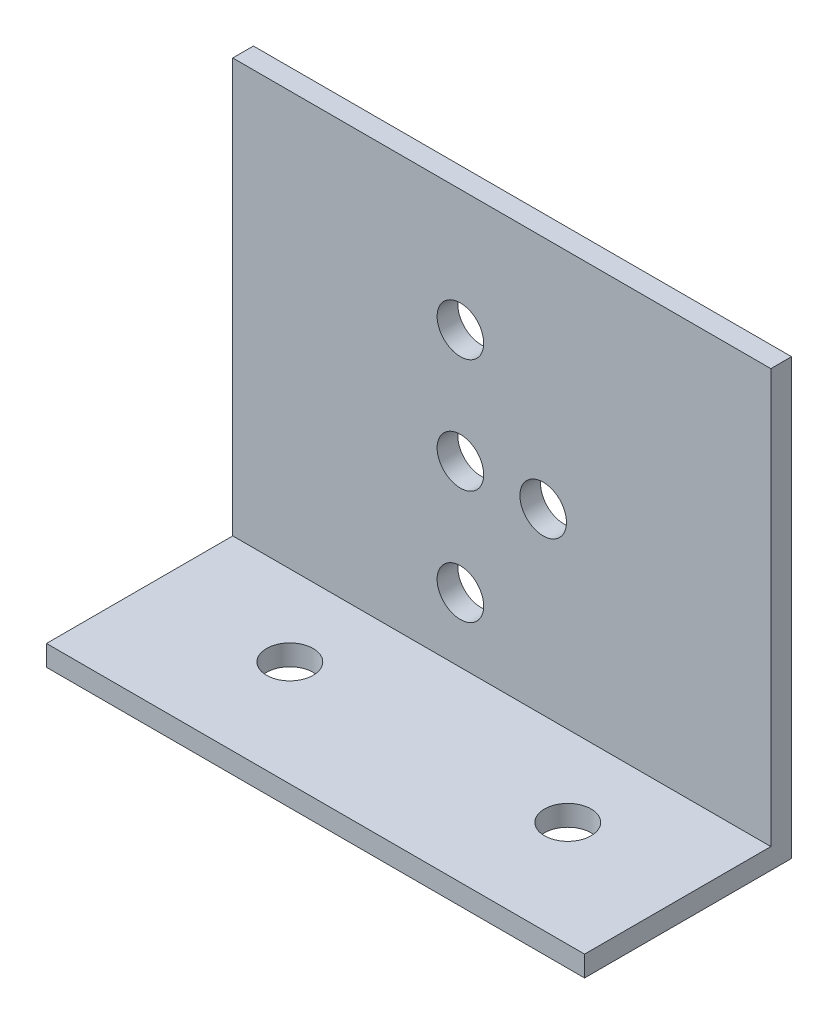
ISO-10303-21;
HEADER;
FILE_DESCRIPTION(('STEP AP214'),'2;1');
FILE_NAME('part.step','',(''),(''),'','','');
FILE_SCHEMA(('AUTOMOTIVE_DESIGN { 1 0 10303 214 1 1 1 1 }'));
ENDSEC;
DATA;
#1=APPLICATION_CONTEXT('core data for automotive mechanical design processes');
#2=APPLICATION_PROTOCOL_DEFINITION('international standard','automotive_design',2000,#1);
#3=PRODUCT_CONTEXT('',#1,'mechanical');
#4=PRODUCT('Part','Part','',(#3));
#5=PRODUCT_RELATED_PRODUCT_CATEGORY('part','',(#4));
#6=PRODUCT_DEFINITION_FORMATION('','',#4);
#7=PRODUCT_DEFINITION_CONTEXT('part definition',#1,'design');
#8=PRODUCT_DEFINITION('design','',#6,#7);
#9=PRODUCT_DEFINITION_SHAPE('','',#8);
#10=(LENGTH_UNIT() NAMED_UNIT(*) SI_UNIT(.MILLI.,.METRE.));
#11=(NAMED_UNIT(*) PLANE_ANGLE_UNIT() SI_UNIT($,.RADIAN.));
#12=(NAMED_UNIT(*) SI_UNIT($,.STERADIAN.) SOLID_ANGLE_UNIT());
#13=UNCERTAINTY_MEASURE_WITH_UNIT(LENGTH_MEASURE(1.E-05),#10,'distance_accuracy_value','');
#14=(GEOMETRIC_REPRESENTATION_CONTEXT(3) GLOBAL_UNCERTAINTY_ASSIGNED_CONTEXT((#13)) GLOBAL_UNIT_ASSIGNED_CONTEXT((#10,
#11,#12)) REPRESENTATION_CONTEXT('',''));
#15=CARTESIAN_POINT('',(0.,0.,0.));
#16=DIRECTION('',(0.,0.,1.));
#17=DIRECTION('',(1.,0.,0.));
#18=AXIS2_PLACEMENT_3D('',#15,#16,#17);
#19=CARTESIAN_POINT('',(0.,0.,20.));
#20=DIRECTION('',(0.,0.,-1.));
#21=DIRECTION('',(-1.,0.,0.));
#22=AXIS2_PLACEMENT_3D('',#19,#20,#21);
#23=PLANE('',#22);
#24=DIRECTION('',(1.,0.,0.));
#25=VECTOR('',#24,1.);
#26=CARTESIAN_POINT('',(0.,-19.,20.));
#27=LINE('',#26,#25);
#28=CARTESIAN_POINT('',(-26.,-19.,20.));
#29=VERTEX_POINT('',#28);
#30=CARTESIAN_POINT('',(26.,-19.,20.));
#31=VERTEX_POINT('',#30);
#32=EDGE_CURVE('E53',#29,#31,#27,.T.);
#33=ORIENTED_EDGE('',*,*,#32,.F.);
#34=DIRECTION('',(0.,-1.,0.));
#35=VECTOR('',#34,1.);
#36=CARTESIAN_POINT('',(-26.,-21.,20.));
#37=LINE('',#36,#35);
#38=CARTESIAN_POINT('',(-26.,-21.,20.));
#39=VERTEX_POINT('',#38);
#40=EDGE_CURVE('E161',#29,#39,#37,.T.);
#41=ORIENTED_EDGE('',*,*,#40,.T.);
#42=DIRECTION('',(1.,0.,0.));
#43=VECTOR('',#42,1.);
#44=CARTESIAN_POINT('',(-26.,-21.,20.));
#45=LINE('',#44,#43);
#46=CARTESIAN_POINT('',(26.,-21.,20.));
#47=VERTEX_POINT('',#46);
#48=EDGE_CURVE('E70',#39,#47,#45,.T.);
#49=ORIENTED_EDGE('',*,*,#48,.T.);
#50=DIRECTION('',(0.,1.,0.));
#51=VECTOR('',#50,1.);
#52=CARTESIAN_POINT('',(26.,-21.,20.));
#53=LINE('',#52,#51);
#54=EDGE_CURVE('E99',#47,#31,#53,.T.);
#55=ORIENTED_EDGE('',*,*,#54,.T.);
#56=EDGE_LOOP('',(#33,#41,#49,#55));
#57=FACE_BOUND('',#56,.T.);
#58=ADVANCED_FACE('F44',(#57),#23,.F.);
#59=CARTESIAN_POINT('',(26.,-21.,20.));
#60=DIRECTION('',(-1.,0.,0.));
#61=DIRECTION('',(0.,0.,1.));
#62=AXIS2_PLACEMENT_3D('',#59,#60,#61);
#63=PLANE('',#62);
#64=DIRECTION('',(0.,0.,-1.));
#65=VECTOR('',#64,1.);
#66=CARTESIAN_POINT('',(26.,21.,20.));
#67=LINE('',#66,#65);
#68=CARTESIAN_POINT('',(26.,21.,2.));
#69=VERTEX_POINT('',#68);
#70=CARTESIAN_POINT('',(26.,21.,0.));
#71=VERTEX_POINT('',#70);
#72=EDGE_CURVE('E125',#69,#71,#67,.T.);
#73=ORIENTED_EDGE('',*,*,#72,.F.);
#74=DIRECTION('',(0.,-1.,0.));
#75=VECTOR('',#74,1.);
#76=CARTESIAN_POINT('',(26.,-21.,2.));
#77=LINE('',#76,#75);
#78=CARTESIAN_POINT('',(26.,-19.,2.));
#79=VERTEX_POINT('',#78);
#80=EDGE_CURVE('E112',#69,#79,#77,.T.);
#81=ORIENTED_EDGE('',*,*,#80,.T.);
#82=DIRECTION('',(0.,0.,-1.));
#83=VECTOR('',#82,1.);
#84=CARTESIAN_POINT('',(26.,-19.,20.));
#85=LINE('',#84,#83);
#86=EDGE_CURVE('E116',#31,#79,#85,.T.);
#87=ORIENTED_EDGE('',*,*,#86,.F.);
#88=ORIENTED_EDGE('',*,*,#54,.F.);
#89=DIRECTION('',(0.,0.,-1.));
#90=VECTOR('',#89,1.);
#91=CARTESIAN_POINT('',(26.,-21.,20.));
#92=LINE('',#91,#90);
#93=CARTESIAN_POINT('',(26.,-21.,0.));
#94=VERTEX_POINT('',#93);
#95=EDGE_CURVE('E92',#47,#94,#92,.T.);
#96=ORIENTED_EDGE('',*,*,#95,.T.);
#97=DIRECTION('',(0.,1.,0.));
#98=VECTOR('',#97,1.);
#99=CARTESIAN_POINT('',(26.,-21.,0.));
#100=LINE('',#99,#98);
#101=EDGE_CURVE('E105',#94,#71,#100,.T.);
#102=ORIENTED_EDGE('',*,*,#101,.T.);
#103=EDGE_LOOP('',(#73,#81,#87,#88,#96,#102));
#104=FACE_BOUND('',#103,.T.);
#105=ADVANCED_FACE('F46',(#104),#63,.F.);
#106=CARTESIAN_POINT('',(-26.,21.,20.));
#107=DIRECTION('',(0.,-1.,0.));
#108=DIRECTION('',(0.,0.,-1.));
#109=AXIS2_PLACEMENT_3D('',#106,#107,#108);
#110=PLANE('',#109);
#111=DIRECTION('',(0.,0.,-1.));
#112=VECTOR('',#111,1.);
#113=CARTESIAN_POINT('',(-26.,21.,20.));
#114=LINE('',#113,#112);
#115=CARTESIAN_POINT('',(-26.,21.,2.));
#116=VERTEX_POINT('',#115);
#117=CARTESIAN_POINT('',(-26.,21.,0.));
#118=VERTEX_POINT('',#117);
#119=EDGE_CURVE('E123',#116,#118,#114,.T.);
#120=ORIENTED_EDGE('',*,*,#119,.F.);
#121=DIRECTION('',(-1.,0.,0.));
#122=VECTOR('',#121,1.);
#123=CARTESIAN_POINT('',(34.4102153998165,21.,2.));
#124=LINE('',#123,#122);
#125=EDGE_CURVE('E153',#69,#116,#124,.T.);
#126=ORIENTED_EDGE('',*,*,#125,.F.);
#127=ORIENTED_EDGE('',*,*,#72,.T.);
#128=DIRECTION('',(-1.,0.,0.));
#129=VECTOR('',#128,1.);
#130=CARTESIAN_POINT('',(-26.,21.,0.));
#131=LINE('',#130,#129);
#132=EDGE_CURVE('E111',#71,#118,#131,.T.);
#133=ORIENTED_EDGE('',*,*,#132,.T.);
#134=EDGE_LOOP('',(#120,#126,#127,#133));
#135=FACE_BOUND('',#134,.T.);
#136=ADVANCED_FACE('F170',(#135),#110,.F.);
#137=CARTESIAN_POINT('',(-26.,-21.,20.));
#138=DIRECTION('',(1.,0.,0.));
#139=DIRECTION('',(0.,0.,-1.));
#140=AXIS2_PLACEMENT_3D('',#137,#138,#139);
#141=PLANE('',#140);
#142=DIRECTION('',(0.,0.,1.));
#143=VECTOR('',#142,1.);
#144=CARTESIAN_POINT('',(-26.,-19.,20.));
#145=LINE('',#144,#143);
#146=CARTESIAN_POINT('',(-26.,-19.,2.));
#147=VERTEX_POINT('',#146);
#148=EDGE_CURVE('E61',#147,#29,#145,.T.);
#149=ORIENTED_EDGE('',*,*,#148,.F.);
#150=DIRECTION('',(0.,1.,0.));
#151=VECTOR('',#150,1.);
#152=CARTESIAN_POINT('',(-26.,-21.,2.));
#153=LINE('',#152,#151);
#154=EDGE_CURVE('E13',#147,#116,#153,.T.);
#155=ORIENTED_EDGE('',*,*,#154,.T.);
#156=ORIENTED_EDGE('',*,*,#119,.T.);
#157=DIRECTION('',(0.,-1.,0.));
#158=VECTOR('',#157,1.);
#159=CARTESIAN_POINT('',(-26.,-21.,0.));
#160=LINE('',#159,#158);
#161=CARTESIAN_POINT('',(-26.,-21.,0.));
#162=VERTEX_POINT('',#161);
#163=EDGE_CURVE('E100',#118,#162,#160,.T.);
#164=ORIENTED_EDGE('',*,*,#163,.T.);
#165=DIRECTION('',(0.,0.,-1.));
#166=VECTOR('',#165,1.);
#167=CARTESIAN_POINT('',(-26.,-21.,20.));
#168=LINE('',#167,#166);
#169=EDGE_CURVE('E95',#39,#162,#168,.T.);
#170=ORIENTED_EDGE('',*,*,#169,.F.);
#171=ORIENTED_EDGE('',*,*,#40,.F.);
#172=EDGE_LOOP('',(#149,#155,#156,#164,#170,#171));
#173=FACE_BOUND('',#172,.T.);
#174=ADVANCED_FACE('F164',(#173),#141,.F.);
#175=CARTESIAN_POINT('',(-26.,-21.,20.));
#176=DIRECTION('',(0.,1.,0.));
#177=DIRECTION('',(0.,0.,1.));
#178=AXIS2_PLACEMENT_3D('',#175,#176,#177);
#179=PLANE('',#178);
#180=CARTESIAN_POINT('',(-12.695679617865,-21.,9.78506331878037));
#181=DIRECTION('',(0.,1.,0.));
#182=DIRECTION('',(0.,0.,1.));
#183=AXIS2_PLACEMENT_3D('',#180,#181,#182);
#184=CIRCLE('',#183,2.25);
#185=CARTESIAN_POINT('',(-12.695679617865,-21.,12.0350633187804));
#186=VERTEX_POINT('',#185);
#187=EDGE_CURVE('E300',#186,#186,#184,.T.);
#188=ORIENTED_EDGE('',*,*,#187,.T.);
#189=EDGE_LOOP('',(#188));
#190=FACE_BOUND('',#189,.T.);
#191=CARTESIAN_POINT('',(14.1630378381379,-21.,9.78506331878037));
#192=DIRECTION('',(0.,1.,0.));
#193=DIRECTION('',(0.,0.,1.));
#194=AXIS2_PLACEMENT_3D('',#191,#192,#193);
#195=CIRCLE('',#194,2.25);
#196=CARTESIAN_POINT('',(14.1630378381379,-21.,12.0350633187804));
#197=VERTEX_POINT('',#196);
#198=EDGE_CURVE('E309',#197,#197,#195,.T.);
#199=ORIENTED_EDGE('',*,*,#198,.T.);
#200=EDGE_LOOP('',(#199));
#201=FACE_BOUND('',#200,.T.);
#202=DIRECTION('',(1.,0.,0.));
#203=VECTOR('',#202,1.);
#204=CARTESIAN_POINT('',(-26.,-21.,0.));
#205=LINE('',#204,#203);
#206=EDGE_CURVE('E89',#162,#94,#205,.T.);
#207=ORIENTED_EDGE('',*,*,#206,.T.);
#208=ORIENTED_EDGE('',*,*,#95,.F.);
#209=ORIENTED_EDGE('',*,*,#48,.F.);
#210=ORIENTED_EDGE('',*,*,#169,.T.);
#211=EDGE_LOOP('',(#207,#208,#209,#210));
#212=FACE_BOUND('',#211,.T.);
#213=ADVANCED_FACE('F91',(#190,#201,#212),#179,.F.);
#214=CARTESIAN_POINT('',(0.,0.,0.));
#215=DIRECTION('',(0.,0.,-1.));
#216=DIRECTION('',(-1.,0.,0.));
#217=AXIS2_PLACEMENT_3D('',#214,#215,#216);
#218=PLANE('',#217);
#219=CARTESIAN_POINT('',(-4.00000000000084,-12.7500000000011,0.));
#220=DIRECTION('',(0.,0.,-1.));
#221=DIRECTION('',(-1.,0.,0.));
#222=AXIS2_PLACEMENT_3D('',#219,#220,#221);
#223=CIRCLE('',#222,2.24999999999999);
#224=CARTESIAN_POINT('',(-6.25000000000083,-12.7500000000011,0.));
#225=VERTEX_POINT('',#224);
#226=EDGE_CURVE('E144',#225,#225,#223,.T.);
#227=ORIENTED_EDGE('',*,*,#226,.F.);
#228=EDGE_LOOP('',(#227));
#229=FACE_BOUND('',#228,.T.);
#230=CARTESIAN_POINT('',(-4.00000000000084,-1.75000000000111,0.));
#231=DIRECTION('',(0.,0.,-1.));
#232=DIRECTION('',(-1.,0.,0.));
#233=AXIS2_PLACEMENT_3D('',#230,#231,#232);
#234=CIRCLE('',#233,2.24999999999999);
#235=CARTESIAN_POINT('',(-6.25000000000083,-1.75000000000111,0.));
#236=VERTEX_POINT('',#235);
#237=EDGE_CURVE('E134',#236,#236,#234,.T.);
#238=ORIENTED_EDGE('',*,*,#237,.F.);
#239=EDGE_LOOP('',(#238));
#240=FACE_BOUND('',#239,.T.);
#241=CARTESIAN_POINT('',(-4.00000000000084,9.2499999999989,0.));
#242=DIRECTION('',(0.,0.,-1.));
#243=DIRECTION('',(-1.,0.,0.));
#244=AXIS2_PLACEMENT_3D('',#241,#242,#243);
#245=CIRCLE('',#244,2.24999999999999);
#246=CARTESIAN_POINT('',(-6.25000000000083,9.2499999999989,0.));
#247=VERTEX_POINT('',#246);
#248=EDGE_CURVE('E131',#247,#247,#245,.T.);
#249=ORIENTED_EDGE('',*,*,#248,.F.);
#250=EDGE_LOOP('',(#249));
#251=FACE_BOUND('',#250,.T.);
#252=CARTESIAN_POINT('',(3.99999999999916,-1.75000000000111,0.));
#253=DIRECTION('',(0.,0.,-1.));
#254=DIRECTION('',(-1.,0.,0.));
#255=AXIS2_PLACEMENT_3D('',#252,#253,#254);
#256=CIRCLE('',#255,2.24999999999999);
#257=CARTESIAN_POINT('',(1.74999999999917,-1.75000000000111,0.));
#258=VERTEX_POINT('',#257);
#259=EDGE_CURVE('E130',#258,#258,#256,.T.);
#260=ORIENTED_EDGE('',*,*,#259,.F.);
#261=EDGE_LOOP('',(#260));
#262=FACE_BOUND('',#261,.T.);
#263=ORIENTED_EDGE('',*,*,#101,.F.);
#264=ORIENTED_EDGE('',*,*,#206,.F.);
#265=ORIENTED_EDGE('',*,*,#163,.F.);
#266=ORIENTED_EDGE('',*,*,#132,.F.);
#267=EDGE_LOOP('',(#263,#264,#265,#266));
#268=FACE_BOUND('',#267,.T.);
#269=ADVANCED_FACE('F109',(#229,#240,#251,#262,#268),#218,.T.);
#270=CARTESIAN_POINT('',(34.4102153998165,-19.,2.));
#271=DIRECTION('',(0.,0.,-1.));
#272=DIRECTION('',(-1.,0.,0.));
#273=AXIS2_PLACEMENT_3D('',#270,#271,#272);
#274=PLANE('',#273);
#275=CARTESIAN_POINT('',(-4.00000000000084,-12.7500000000011,2.));
#276=DIRECTION('',(0.,0.,-1.));
#277=DIRECTION('',(-1.,0.,0.));
#278=AXIS2_PLACEMENT_3D('',#275,#276,#277);
#279=CIRCLE('',#278,2.24999999999999);
#280=CARTESIAN_POINT('',(-6.25000000000084,-12.7500000000011,2.));
#281=VERTEX_POINT('',#280);
#282=EDGE_CURVE('E48',#281,#281,#279,.T.);
#283=ORIENTED_EDGE('',*,*,#282,.T.);
#284=EDGE_LOOP('',(#283));
#285=FACE_BOUND('',#284,.T.);
#286=CARTESIAN_POINT('',(-4.00000000000084,-1.75000000000111,2.));
#287=DIRECTION('',(0.,0.,-1.));
#288=DIRECTION('',(-1.,0.,0.));
#289=AXIS2_PLACEMENT_3D('',#286,#287,#288);
#290=CIRCLE('',#289,2.24999999999999);
#291=CARTESIAN_POINT('',(-6.25000000000084,-1.75000000000111,2.));
#292=VERTEX_POINT('',#291);
#293=EDGE_CURVE('E132',#292,#292,#290,.T.);
#294=ORIENTED_EDGE('',*,*,#293,.T.);
#295=EDGE_LOOP('',(#294));
#296=FACE_BOUND('',#295,.T.);
#297=CARTESIAN_POINT('',(-4.00000000000084,9.2499999999989,2.));
#298=DIRECTION('',(0.,0.,-1.));
#299=DIRECTION('',(-1.,0.,0.));
#300=AXIS2_PLACEMENT_3D('',#297,#298,#299);
#301=CIRCLE('',#300,2.24999999999999);
#302=CARTESIAN_POINT('',(-6.25000000000084,9.2499999999989,2.));
#303=VERTEX_POINT('',#302);
#304=EDGE_CURVE('E128',#303,#303,#301,.T.);
#305=ORIENTED_EDGE('',*,*,#304,.T.);
#306=EDGE_LOOP('',(#305));
#307=FACE_BOUND('',#306,.T.);
#308=CARTESIAN_POINT('',(3.99999999999916,-1.75000000000111,2.));
#309=DIRECTION('',(0.,0.,-1.));
#310=DIRECTION('',(-1.,0.,0.));
#311=AXIS2_PLACEMENT_3D('',#308,#309,#310);
#312=CIRCLE('',#311,2.24999999999999);
#313=CARTESIAN_POINT('',(1.74999999999916,-1.75000000000111,2.));
#314=VERTEX_POINT('',#313);
#315=EDGE_CURVE('E150',#314,#314,#312,.T.);
#316=ORIENTED_EDGE('',*,*,#315,.T.);
#317=EDGE_LOOP('',(#316));
#318=FACE_BOUND('',#317,.T.);
#319=ORIENTED_EDGE('',*,*,#125,.T.);
#320=ORIENTED_EDGE('',*,*,#154,.F.);
#321=DIRECTION('',(-1.,0.,0.));
#322=VECTOR('',#321,1.);
#323=CARTESIAN_POINT('',(34.4102153998165,-19.,2.));
#324=LINE('',#323,#322);
#325=EDGE_CURVE('E154',#79,#147,#324,.T.);
#326=ORIENTED_EDGE('',*,*,#325,.F.);
#327=ORIENTED_EDGE('',*,*,#80,.F.);
#328=EDGE_LOOP('',(#319,#320,#326,#327));
#329=FACE_BOUND('',#328,.T.);
#330=ADVANCED_FACE('F182',(#285,#296,#307,#318,#329),#274,.F.);
#331=CARTESIAN_POINT('',(0.,-19.,0.));
#332=DIRECTION('',(0.,1.,0.));
#333=DIRECTION('',(0.,0.,1.));
#334=AXIS2_PLACEMENT_3D('',#331,#332,#333);
#335=PLANE('',#334);
#336=CARTESIAN_POINT('',(-12.695679617865,-19.,9.78506331878037));
#337=DIRECTION('',(0.,1.,0.));
#338=DIRECTION('',(0.,0.,1.));
#339=AXIS2_PLACEMENT_3D('',#336,#337,#338);
#340=CIRCLE('',#339,2.24999999999999);
#341=CARTESIAN_POINT('',(-12.695679617865,-19.,12.0350633187804));
#342=VERTEX_POINT('',#341);
#343=EDGE_CURVE('E303',#342,#342,#340,.T.);
#344=ORIENTED_EDGE('',*,*,#343,.F.);
#345=EDGE_LOOP('',(#344));
#346=FACE_BOUND('',#345,.T.);
#347=CARTESIAN_POINT('',(14.1630378381379,-19.,9.78506331878037));
#348=DIRECTION('',(0.,1.,0.));
#349=DIRECTION('',(0.,0.,1.));
#350=AXIS2_PLACEMENT_3D('',#347,#348,#349);
#351=CIRCLE('',#350,2.24999999999999);
#352=CARTESIAN_POINT('',(14.1630378381379,-19.,12.0350633187804));
#353=VERTEX_POINT('',#352);
#354=EDGE_CURVE('E305',#353,#353,#351,.T.);
#355=ORIENTED_EDGE('',*,*,#354,.F.);
#356=EDGE_LOOP('',(#355));
#357=FACE_BOUND('',#356,.T.);
#358=ORIENTED_EDGE('',*,*,#86,.T.);
#359=ORIENTED_EDGE('',*,*,#325,.T.);
#360=ORIENTED_EDGE('',*,*,#148,.T.);
#361=ORIENTED_EDGE('',*,*,#32,.T.);
#362=EDGE_LOOP('',(#358,#359,#360,#361));
#363=FACE_BOUND('',#362,.T.);
#364=ADVANCED_FACE('F181',(#346,#357,#363),#335,.T.);
#365=CARTESIAN_POINT('',(3.99999999999916,-1.75000000000111,0.));
#366=DIRECTION('',(0.,0.,-1.));
#367=DIRECTION('',(-1.,0.,0.));
#368=AXIS2_PLACEMENT_3D('',#365,#366,#367);
#369=CYLINDRICAL_SURFACE('',#368,2.24999999999999);
#370=ORIENTED_EDGE('',*,*,#259,.T.);
#371=EDGE_LOOP('',(#370));
#372=FACE_BOUND('',#371,.T.);
#373=ORIENTED_EDGE('',*,*,#315,.F.);
#374=EDGE_LOOP('',(#373));
#375=FACE_BOUND('',#374,.T.);
#376=ADVANCED_FACE('F191',(#372,#375),#369,.F.);
#377=CARTESIAN_POINT('',(-4.00000000000084,9.2499999999989,0.));
#378=DIRECTION('',(0.,0.,-1.));
#379=DIRECTION('',(-1.,0.,0.));
#380=AXIS2_PLACEMENT_3D('',#377,#378,#379);
#381=CYLINDRICAL_SURFACE('',#380,2.24999999999999);
#382=ORIENTED_EDGE('',*,*,#248,.T.);
#383=EDGE_LOOP('',(#382));
#384=FACE_BOUND('',#383,.T.);
#385=ORIENTED_EDGE('',*,*,#304,.F.);
#386=EDGE_LOOP('',(#385));
#387=FACE_BOUND('',#386,.T.);
#388=ADVANCED_FACE('F246',(#384,#387),#381,.F.);
#389=CARTESIAN_POINT('',(-4.00000000000084,-1.75000000000111,0.));
#390=DIRECTION('',(0.,0.,-1.));
#391=DIRECTION('',(-1.,0.,0.));
#392=AXIS2_PLACEMENT_3D('',#389,#390,#391);
#393=CYLINDRICAL_SURFACE('',#392,2.24999999999999);
#394=ORIENTED_EDGE('',*,*,#237,.T.);
#395=EDGE_LOOP('',(#394));
#396=FACE_BOUND('',#395,.T.);
#397=ORIENTED_EDGE('',*,*,#293,.F.);
#398=EDGE_LOOP('',(#397));
#399=FACE_BOUND('',#398,.T.);
#400=ADVANCED_FACE('F253',(#396,#399),#393,.F.);
#401=CARTESIAN_POINT('',(-4.00000000000084,-12.7500000000011,0.));
#402=DIRECTION('',(0.,0.,-1.));
#403=DIRECTION('',(-1.,0.,0.));
#404=AXIS2_PLACEMENT_3D('',#401,#402,#403);
#405=CYLINDRICAL_SURFACE('',#404,2.24999999999999);
#406=ORIENTED_EDGE('',*,*,#226,.T.);
#407=EDGE_LOOP('',(#406));
#408=FACE_BOUND('',#407,.T.);
#409=ORIENTED_EDGE('',*,*,#282,.F.);
#410=EDGE_LOOP('',(#409));
#411=FACE_BOUND('',#410,.T.);
#412=ADVANCED_FACE('F261',(#408,#411),#405,.F.);
#413=CARTESIAN_POINT('',(14.1630378381379,-19.,9.78506331878037));
#414=DIRECTION('',(0.,1.,0.));
#415=DIRECTION('',(0.,0.,1.));
#416=AXIS2_PLACEMENT_3D('',#413,#414,#415);
#417=CYLINDRICAL_SURFACE('',#416,2.24999999999999);
#418=ORIENTED_EDGE('',*,*,#198,.F.);
#419=EDGE_LOOP('',(#418));
#420=FACE_BOUND('',#419,.T.);
#421=ORIENTED_EDGE('',*,*,#354,.T.);
#422=EDGE_LOOP('',(#421));
#423=FACE_BOUND('',#422,.T.);
#424=ADVANCED_FACE('F267',(#420,#423),#417,.F.);
#425=CARTESIAN_POINT('',(-12.695679617865,-19.,9.78506331878037));
#426=DIRECTION('',(0.,1.,0.));
#427=DIRECTION('',(0.,0.,1.));
#428=AXIS2_PLACEMENT_3D('',#425,#426,#427);
#429=CYLINDRICAL_SURFACE('',#428,2.24999999999999);
#430=ORIENTED_EDGE('',*,*,#187,.F.);
#431=EDGE_LOOP('',(#430));
#432=FACE_BOUND('',#431,.T.);
#433=ORIENTED_EDGE('',*,*,#343,.T.);
#434=EDGE_LOOP('',(#433));
#435=FACE_BOUND('',#434,.T.);
#436=ADVANCED_FACE('F274',(#432,#435),#429,.F.);
#437=CLOSED_SHELL('',(#58,#105,#136,#174,#213,#269,#330,#364,#376,#388,#400,#412,#424,#436));
#438=MANIFOLD_SOLID_BREP('B2',#437);
#439=ADVANCED_BREP_SHAPE_REPRESENTATION('',(#18,#438),#14);
#440=SHAPE_DEFINITION_REPRESENTATION(#9,#439);
ENDSEC;
END-ISO-10303-21;
